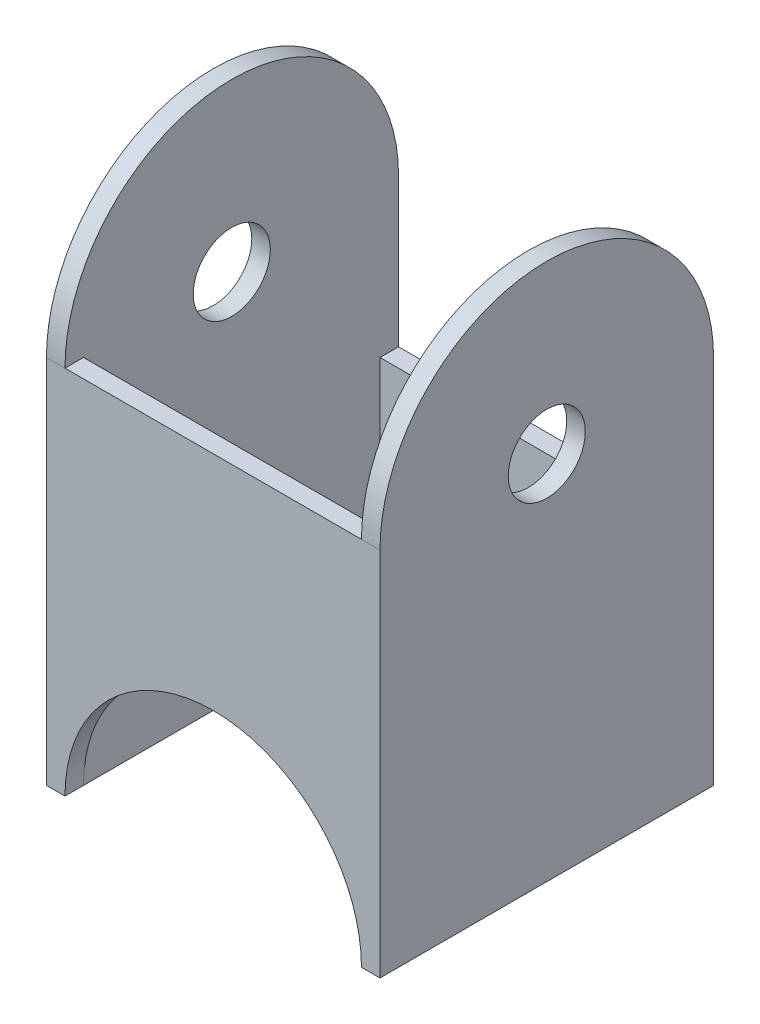
ISO-10303-21;
HEADER;
FILE_DESCRIPTION(('STEP AP214'),'2;1');
FILE_NAME('part.step','',(''),(''),'','','');
FILE_SCHEMA(('AUTOMOTIVE_DESIGN { 1 0 10303 214 1 1 1 1 }'));
ENDSEC;
DATA;
#1=APPLICATION_CONTEXT('core data for automotive mechanical design processes');
#2=APPLICATION_PROTOCOL_DEFINITION('international standard','automotive_design',2000,#1);
#3=PRODUCT_CONTEXT('',#1,'mechanical');
#4=PRODUCT('Part','Part','',(#3));
#5=PRODUCT_RELATED_PRODUCT_CATEGORY('part','',(#4));
#6=PRODUCT_DEFINITION_FORMATION('','',#4);
#7=PRODUCT_DEFINITION_CONTEXT('part definition',#1,'design');
#8=PRODUCT_DEFINITION('design','',#6,#7);
#9=PRODUCT_DEFINITION_SHAPE('','',#8);
#10=(LENGTH_UNIT() NAMED_UNIT(*) SI_UNIT(.MILLI.,.METRE.));
#11=(NAMED_UNIT(*) PLANE_ANGLE_UNIT() SI_UNIT($,.RADIAN.));
#12=(NAMED_UNIT(*) SI_UNIT($,.STERADIAN.) SOLID_ANGLE_UNIT());
#13=UNCERTAINTY_MEASURE_WITH_UNIT(LENGTH_MEASURE(1.E-05),#10,'distance_accuracy_value','');
#14=(GEOMETRIC_REPRESENTATION_CONTEXT(3) GLOBAL_UNCERTAINTY_ASSIGNED_CONTEXT((#13)) GLOBAL_UNIT_ASSIGNED_CONTEXT((#10,
#11,#12)) REPRESENTATION_CONTEXT('',''));
#15=CARTESIAN_POINT('',(0.,0.,0.));
#16=DIRECTION('',(0.,0.,1.));
#17=DIRECTION('',(1.,0.,0.));
#18=AXIS2_PLACEMENT_3D('',#15,#16,#17);
#19=CARTESIAN_POINT('',(0.,0.,0.));
#20=DIRECTION('',(0.,1.,0.));
#21=DIRECTION('',(0.,0.,1.));
#22=AXIS2_PLACEMENT_3D('',#19,#20,#21);
#23=PLANE('',#22);
#24=DIRECTION('',(-1.,0.,0.));
#25=VECTOR('',#24,1.);
#26=CARTESIAN_POINT('',(-14.2875,0.,-14.2875));
#27=LINE('',#26,#25);
#28=CARTESIAN_POINT('',(-12.7,0.,-14.2875));
#29=VERTEX_POINT('',#28);
#30=CARTESIAN_POINT('',(-14.2875,0.,-14.2875));
#31=VERTEX_POINT('',#30);
#32=EDGE_CURVE('E241',#29,#31,#27,.T.);
#33=ORIENTED_EDGE('',*,*,#32,.F.);
#34=DIRECTION('',(0.,0.,1.));
#35=VECTOR('',#34,1.);
#36=CARTESIAN_POINT('',(-12.7,0.,-14.2875));
#37=LINE('',#36,#35);
#38=CARTESIAN_POINT('',(-12.7,0.,-12.7));
#39=VERTEX_POINT('',#38);
#40=EDGE_CURVE('E184',#29,#39,#37,.T.);
#41=ORIENTED_EDGE('',*,*,#40,.T.);
#42=DIRECTION('',(0.,0.,1.));
#43=VECTOR('',#42,1.);
#44=CARTESIAN_POINT('',(-12.7,0.,-12.7));
#45=LINE('',#44,#43);
#46=CARTESIAN_POINT('',(-12.7,0.,12.7));
#47=VERTEX_POINT('',#46);
#48=EDGE_CURVE('E218',#39,#47,#45,.T.);
#49=ORIENTED_EDGE('',*,*,#48,.T.);
#50=CARTESIAN_POINT('',(-12.7,0.,14.2875));
#51=VERTEX_POINT('',#50);
#52=EDGE_CURVE('E181',#47,#51,#37,.T.);
#53=ORIENTED_EDGE('',*,*,#52,.T.);
#54=DIRECTION('',(1.,0.,0.));
#55=VECTOR('',#54,1.);
#56=CARTESIAN_POINT('',(-14.2875,0.,14.2875));
#57=LINE('',#56,#55);
#58=CARTESIAN_POINT('',(-14.2875,0.,14.2875));
#59=VERTEX_POINT('',#58);
#60=EDGE_CURVE('E234',#59,#51,#57,.T.);
#61=ORIENTED_EDGE('',*,*,#60,.F.);
#62=DIRECTION('',(0.,0.,1.));
#63=VECTOR('',#62,1.);
#64=CARTESIAN_POINT('',(-14.2875,0.,-14.2875));
#65=LINE('',#64,#63);
#66=EDGE_CURVE('E245',#31,#59,#65,.T.);
#67=ORIENTED_EDGE('',*,*,#66,.F.);
#68=EDGE_LOOP('',(#33,#41,#49,#53,#61,#67));
#69=FACE_BOUND('',#68,.T.);
#70=ADVANCED_FACE('F41',(#69),#23,.F.);
#71=CARTESIAN_POINT('',(0.,31.75,0.));
#72=DIRECTION('',(0.,1.,0.));
#73=DIRECTION('',(0.,0.,1.));
#74=AXIS2_PLACEMENT_3D('',#71,#72,#73);
#75=PLANE('',#74);
#76=DIRECTION('',(0.,0.,1.));
#77=VECTOR('',#76,1.);
#78=CARTESIAN_POINT('',(12.7,31.75,0.));
#79=LINE('',#78,#77);
#80=CARTESIAN_POINT('',(12.7,31.75,12.7));
#81=VERTEX_POINT('',#80);
#82=CARTESIAN_POINT('',(12.7,31.75,14.2875));
#83=VERTEX_POINT('',#82);
#84=EDGE_CURVE('E201',#81,#83,#79,.T.);
#85=ORIENTED_EDGE('',*,*,#84,.F.);
#86=DIRECTION('',(1.,0.,0.));
#87=VECTOR('',#86,1.);
#88=CARTESIAN_POINT('',(-12.7,31.75,12.7));
#89=LINE('',#88,#87);
#90=CARTESIAN_POINT('',(-12.7,31.75,12.7));
#91=VERTEX_POINT('',#90);
#92=EDGE_CURVE('E215',#91,#81,#89,.T.);
#93=ORIENTED_EDGE('',*,*,#92,.F.);
#94=DIRECTION('',(0.,0.,-1.));
#95=VECTOR('',#94,1.);
#96=CARTESIAN_POINT('',(-12.7,31.75,0.));
#97=LINE('',#96,#95);
#98=CARTESIAN_POINT('',(-12.7,31.75,14.2875));
#99=VERTEX_POINT('',#98);
#100=EDGE_CURVE('E210',#99,#91,#97,.T.);
#101=ORIENTED_EDGE('',*,*,#100,.F.);
#102=DIRECTION('',(1.,0.,0.));
#103=VECTOR('',#102,1.);
#104=CARTESIAN_POINT('',(-14.2875,31.75,14.2875));
#105=LINE('',#104,#103);
#106=EDGE_CURVE('E233',#99,#83,#105,.T.);
#107=ORIENTED_EDGE('',*,*,#106,.T.);
#108=EDGE_LOOP('',(#85,#93,#101,#107));
#109=FACE_BOUND('',#108,.T.);
#110=ADVANCED_FACE('F279',(#109),#75,.T.);
#111=CARTESIAN_POINT('',(12.7,0.,14.2875));
#112=VERTEX_POINT('',#111);
#113=CARTESIAN_POINT('',(14.2875,0.,14.2875));
#114=VERTEX_POINT('',#113);
#115=EDGE_CURVE('E247',#112,#114,#57,.T.);
#116=ORIENTED_EDGE('',*,*,#115,.F.);
#117=DIRECTION('',(0.,0.,1.));
#118=VECTOR('',#117,1.);
#119=CARTESIAN_POINT('',(12.7,0.,-14.2875));
#120=LINE('',#119,#118);
#121=CARTESIAN_POINT('',(12.7,0.,12.7));
#122=VERTEX_POINT('',#121);
#123=EDGE_CURVE('E178',#112,#122,#120,.F.);
#124=ORIENTED_EDGE('',*,*,#123,.T.);
#125=DIRECTION('',(0.,0.,-1.));
#126=VECTOR('',#125,1.);
#127=CARTESIAN_POINT('',(12.7,0.,-12.7));
#128=LINE('',#127,#126);
#129=CARTESIAN_POINT('',(12.7,0.,-12.7));
#130=VERTEX_POINT('',#129);
#131=EDGE_CURVE('E214',#122,#130,#128,.T.);
#132=ORIENTED_EDGE('',*,*,#131,.T.);
#133=CARTESIAN_POINT('',(12.7,0.,-14.2875));
#134=VERTEX_POINT('',#133);
#135=EDGE_CURVE('E174',#130,#134,#120,.F.);
#136=ORIENTED_EDGE('',*,*,#135,.T.);
#137=CARTESIAN_POINT('',(14.2875,0.,-14.2875));
#138=VERTEX_POINT('',#137);
#139=EDGE_CURVE('E242',#138,#134,#27,.T.);
#140=ORIENTED_EDGE('',*,*,#139,.F.);
#141=DIRECTION('',(0.,0.,-1.));
#142=VECTOR('',#141,1.);
#143=CARTESIAN_POINT('',(14.2875,0.,-14.2875));
#144=LINE('',#143,#142);
#145=EDGE_CURVE('E229',#114,#138,#144,.T.);
#146=ORIENTED_EDGE('',*,*,#145,.F.);
#147=EDGE_LOOP('',(#116,#124,#132,#136,#140,#146));
#148=FACE_BOUND('',#147,.T.);
#149=ADVANCED_FACE('F282',(#148),#23,.F.);
#150=CARTESIAN_POINT('',(14.2875,31.75,-14.2875));
#151=DIRECTION('',(-1.,0.,0.));
#152=DIRECTION('',(0.,0.,1.));
#153=AXIS2_PLACEMENT_3D('',#150,#151,#152);
#154=PLANE('',#153);
#155=CARTESIAN_POINT('',(14.2875,31.75,0.));
#156=DIRECTION('',(-1.,0.,0.));
#157=DIRECTION('',(0.,0.,1.));
#158=AXIS2_PLACEMENT_3D('',#155,#156,#157);
#159=CIRCLE('',#158,3.302);
#160=CARTESIAN_POINT('',(14.2875,31.75,3.302));
#161=VERTEX_POINT('',#160);
#162=EDGE_CURVE('E185',#161,#161,#159,.T.);
#163=ORIENTED_EDGE('',*,*,#162,.T.);
#164=EDGE_LOOP('',(#163));
#165=FACE_BOUND('',#164,.T.);
#166=DIRECTION('',(0.,-1.,0.));
#167=VECTOR('',#166,1.);
#168=CARTESIAN_POINT('',(14.2875,31.75,-14.2875));
#169=LINE('',#168,#167);
#170=CARTESIAN_POINT('',(14.2875,31.75,-14.2875));
#171=VERTEX_POINT('',#170);
#172=EDGE_CURVE('E49',#171,#138,#169,.T.);
#173=ORIENTED_EDGE('',*,*,#172,.F.);
#174=CARTESIAN_POINT('',(14.2875,31.75,0.));
#175=DIRECTION('',(1.,0.,0.));
#176=DIRECTION('',(0.,0.,-1.));
#177=AXIS2_PLACEMENT_3D('',#174,#175,#176);
#178=CIRCLE('',#177,14.2875);
#179=CARTESIAN_POINT('',(14.2875,31.75,14.2875));
#180=VERTEX_POINT('',#179);
#181=EDGE_CURVE('E195',#171,#180,#178,.T.);
#182=ORIENTED_EDGE('',*,*,#181,.T.);
#183=DIRECTION('',(0.,-1.,0.));
#184=VECTOR('',#183,1.);
#185=CARTESIAN_POINT('',(14.2875,31.75,14.2875));
#186=LINE('',#185,#184);
#187=EDGE_CURVE('E238',#180,#114,#186,.T.);
#188=ORIENTED_EDGE('',*,*,#187,.T.);
#189=ORIENTED_EDGE('',*,*,#145,.T.);
#190=EDGE_LOOP('',(#173,#182,#188,#189));
#191=FACE_BOUND('',#190,.T.);
#192=ADVANCED_FACE('F43',(#165,#191),#154,.F.);
#193=CARTESIAN_POINT('',(-14.2875,31.75,-14.2875));
#194=DIRECTION('',(0.,0.,1.));
#195=DIRECTION('',(1.,0.,0.));
#196=AXIS2_PLACEMENT_3D('',#193,#194,#195);
#197=PLANE('',#196);
#198=DIRECTION('',(-1.,0.,0.));
#199=VECTOR('',#198,1.);
#200=CARTESIAN_POINT('',(27.7111525448112,31.75,-14.2875));
#201=LINE('',#200,#199);
#202=CARTESIAN_POINT('',(-12.7,31.75,-14.2875));
#203=VERTEX_POINT('',#202);
#204=CARTESIAN_POINT('',(-14.2875,31.75,-14.2875));
#205=VERTEX_POINT('',#204);
#206=EDGE_CURVE('E161',#203,#205,#201,.T.);
#207=ORIENTED_EDGE('',*,*,#206,.F.);
#208=DIRECTION('',(0.,1.,0.));
#209=VECTOR('',#208,1.);
#210=CARTESIAN_POINT('',(-12.7,31.75,-14.2875));
#211=LINE('',#210,#209);
#212=CARTESIAN_POINT('',(-12.7,19.05,-14.2875));
#213=VERTEX_POINT('',#212);
#214=EDGE_CURVE('E142',#213,#203,#211,.T.);
#215=ORIENTED_EDGE('',*,*,#214,.F.);
#216=DIRECTION('',(-1.,0.,0.));
#217=VECTOR('',#216,1.);
#218=CARTESIAN_POINT('',(-12.7,19.05,-14.2875));
#219=LINE('',#218,#217);
#220=CARTESIAN_POINT('',(12.7,19.05,-14.2875));
#221=VERTEX_POINT('',#220);
#222=EDGE_CURVE('E153',#221,#213,#219,.T.);
#223=ORIENTED_EDGE('',*,*,#222,.F.);
#224=DIRECTION('',(0.,-1.,0.));
#225=VECTOR('',#224,1.);
#226=CARTESIAN_POINT('',(12.7,31.75,-14.2875));
#227=LINE('',#226,#225);
#228=CARTESIAN_POINT('',(12.7,31.75,-14.2875));
#229=VERTEX_POINT('',#228);
#230=EDGE_CURVE('E163',#229,#221,#227,.T.);
#231=ORIENTED_EDGE('',*,*,#230,.F.);
#232=DIRECTION('',(-1.,0.,0.));
#233=VECTOR('',#232,1.);
#234=CARTESIAN_POINT('',(-14.2875,31.75,-14.2875));
#235=LINE('',#234,#233);
#236=EDGE_CURVE('E230',#171,#229,#235,.T.);
#237=ORIENTED_EDGE('',*,*,#236,.F.);
#238=ORIENTED_EDGE('',*,*,#172,.T.);
#239=ORIENTED_EDGE('',*,*,#139,.T.);
#240=CARTESIAN_POINT('',(0.,0.,-14.2875));
#241=DIRECTION('',(0.,0.,1.));
#242=DIRECTION('',(1.,0.,0.));
#243=AXIS2_PLACEMENT_3D('',#240,#241,#242);
#244=CIRCLE('',#243,12.7);
#245=EDGE_CURVE('E157',#134,#29,#244,.T.);
#246=ORIENTED_EDGE('',*,*,#245,.T.);
#247=ORIENTED_EDGE('',*,*,#32,.T.);
#248=DIRECTION('',(0.,-1.,0.));
#249=VECTOR('',#248,1.);
#250=CARTESIAN_POINT('',(-14.2875,31.75,-14.2875));
#251=LINE('',#250,#249);
#252=EDGE_CURVE('E255',#205,#31,#251,.T.);
#253=ORIENTED_EDGE('',*,*,#252,.F.);
#254=EDGE_LOOP('',(#207,#215,#223,#231,#237,#238,#239,#246,#247,#253));
#255=FACE_BOUND('',#254,.T.);
#256=ADVANCED_FACE('F159',(#255),#197,.F.);
#257=CARTESIAN_POINT('',(-14.2875,31.75,-14.2875));
#258=DIRECTION('',(1.,0.,0.));
#259=DIRECTION('',(0.,0.,-1.));
#260=AXIS2_PLACEMENT_3D('',#257,#258,#259);
#261=PLANE('',#260);
#262=CARTESIAN_POINT('',(-14.2875,31.75,0.));
#263=DIRECTION('',(1.,0.,0.));
#264=DIRECTION('',(0.,0.,-1.));
#265=AXIS2_PLACEMENT_3D('',#262,#263,#264);
#266=CIRCLE('',#265,3.302);
#267=CARTESIAN_POINT('',(-14.2875,31.75,-3.302));
#268=VERTEX_POINT('',#267);
#269=EDGE_CURVE('E192',#268,#268,#266,.T.);
#270=ORIENTED_EDGE('',*,*,#269,.T.);
#271=EDGE_LOOP('',(#270));
#272=FACE_BOUND('',#271,.T.);
#273=DIRECTION('',(0.,-1.,0.));
#274=VECTOR('',#273,1.);
#275=CARTESIAN_POINT('',(-14.2875,31.75,14.2875));
#276=LINE('',#275,#274);
#277=CARTESIAN_POINT('',(-14.2875,31.75,14.2875));
#278=VERTEX_POINT('',#277);
#279=EDGE_CURVE('E252',#278,#59,#276,.T.);
#280=ORIENTED_EDGE('',*,*,#279,.F.);
#281=CARTESIAN_POINT('',(-14.2875,31.75,0.));
#282=DIRECTION('',(-1.,0.,0.));
#283=DIRECTION('',(0.,0.,1.));
#284=AXIS2_PLACEMENT_3D('',#281,#282,#283);
#285=CIRCLE('',#284,14.2875);
#286=EDGE_CURVE('E205',#278,#205,#285,.T.);
#287=ORIENTED_EDGE('',*,*,#286,.T.);
#288=ORIENTED_EDGE('',*,*,#252,.T.);
#289=ORIENTED_EDGE('',*,*,#66,.T.);
#290=EDGE_LOOP('',(#280,#287,#288,#289));
#291=FACE_BOUND('',#290,.T.);
#292=ADVANCED_FACE('F320',(#272,#291),#261,.F.);
#293=CARTESIAN_POINT('',(-14.2875,31.75,14.2875));
#294=DIRECTION('',(0.,0.,-1.));
#295=DIRECTION('',(-1.,0.,0.));
#296=AXIS2_PLACEMENT_3D('',#293,#294,#295);
#297=PLANE('',#296);
#298=ORIENTED_EDGE('',*,*,#60,.T.);
#299=CARTESIAN_POINT('',(0.,0.,14.2875));
#300=DIRECTION('',(0.,0.,-1.));
#301=DIRECTION('',(-1.,0.,0.));
#302=AXIS2_PLACEMENT_3D('',#299,#300,#301);
#303=CIRCLE('',#302,12.7);
#304=EDGE_CURVE('E177',#51,#112,#303,.T.);
#305=ORIENTED_EDGE('',*,*,#304,.T.);
#306=ORIENTED_EDGE('',*,*,#115,.T.);
#307=ORIENTED_EDGE('',*,*,#187,.F.);
#308=DIRECTION('',(1.,0.,0.));
#309=VECTOR('',#308,1.);
#310=CARTESIAN_POINT('',(-27.7111525448112,31.75,14.2875));
#311=LINE('',#310,#309);
#312=EDGE_CURVE('E56',#83,#180,#311,.T.);
#313=ORIENTED_EDGE('',*,*,#312,.F.);
#314=ORIENTED_EDGE('',*,*,#106,.F.);
#315=EDGE_CURVE('E235',#278,#99,#105,.T.);
#316=ORIENTED_EDGE('',*,*,#315,.F.);
#317=ORIENTED_EDGE('',*,*,#279,.T.);
#318=EDGE_LOOP('',(#298,#305,#306,#307,#313,#314,#316,#317));
#319=FACE_BOUND('',#318,.T.);
#320=ADVANCED_FACE('F301',(#319),#297,.F.);
#321=CARTESIAN_POINT('',(12.7,31.75,-12.7));
#322=DIRECTION('',(-1.,0.,0.));
#323=DIRECTION('',(0.,0.,1.));
#324=AXIS2_PLACEMENT_3D('',#321,#322,#323);
#325=PLANE('',#324);
#326=CARTESIAN_POINT('',(12.7,31.75,0.));
#327=DIRECTION('',(-1.,0.,0.));
#328=DIRECTION('',(0.,0.,1.));
#329=AXIS2_PLACEMENT_3D('',#326,#327,#328);
#330=CIRCLE('',#329,3.302);
#331=CARTESIAN_POINT('',(12.7,31.75,3.302));
#332=VERTEX_POINT('',#331);
#333=EDGE_CURVE('E189',#332,#332,#330,.T.);
#334=ORIENTED_EDGE('',*,*,#333,.F.);
#335=EDGE_LOOP('',(#334));
#336=FACE_BOUND('',#335,.T.);
#337=ORIENTED_EDGE('',*,*,#131,.F.);
#338=DIRECTION('',(0.,-1.,0.));
#339=VECTOR('',#338,1.);
#340=CARTESIAN_POINT('',(12.7,31.75,12.7));
#341=LINE('',#340,#339);
#342=EDGE_CURVE('E217',#81,#122,#341,.T.);
#343=ORIENTED_EDGE('',*,*,#342,.F.);
#344=ORIENTED_EDGE('',*,*,#84,.T.);
#345=CARTESIAN_POINT('',(12.7,31.75,0.));
#346=DIRECTION('',(-1.,0.,0.));
#347=DIRECTION('',(0.,0.,1.));
#348=AXIS2_PLACEMENT_3D('',#345,#346,#347);
#349=CIRCLE('',#348,14.2875);
#350=EDGE_CURVE('E198',#229,#83,#349,.F.);
#351=ORIENTED_EDGE('',*,*,#350,.F.);
#352=ORIENTED_EDGE('',*,*,#230,.T.);
#353=DIRECTION('',(0.,0.,1.));
#354=VECTOR('',#353,1.);
#355=CARTESIAN_POINT('',(12.7,19.05,-14.2885));
#356=LINE('',#355,#354);
#357=CARTESIAN_POINT('',(12.7,19.05,-12.7));
#358=VERTEX_POINT('',#357);
#359=EDGE_CURVE('E149',#221,#358,#356,.T.);
#360=ORIENTED_EDGE('',*,*,#359,.T.);
#361=DIRECTION('',(0.,-1.,0.));
#362=VECTOR('',#361,1.);
#363=CARTESIAN_POINT('',(12.7,31.75,-12.7));
#364=LINE('',#363,#362);
#365=EDGE_CURVE('E227',#358,#130,#364,.T.);
#366=ORIENTED_EDGE('',*,*,#365,.T.);
#367=EDGE_LOOP('',(#337,#343,#344,#351,#352,#360,#366));
#368=FACE_BOUND('',#367,.T.);
#369=ADVANCED_FACE('F275',(#336,#368),#325,.T.);
#370=CARTESIAN_POINT('',(-12.7,31.75,-12.7));
#371=DIRECTION('',(0.,0.,1.));
#372=DIRECTION('',(1.,0.,0.));
#373=AXIS2_PLACEMENT_3D('',#370,#371,#372);
#374=PLANE('',#373);
#375=DIRECTION('',(1.,0.,0.));
#376=VECTOR('',#375,1.);
#377=CARTESIAN_POINT('',(-12.7,19.05,-12.7));
#378=LINE('',#377,#376);
#379=CARTESIAN_POINT('',(-12.7,19.05,-12.7));
#380=VERTEX_POINT('',#379);
#381=EDGE_CURVE('E150',#380,#358,#378,.T.);
#382=ORIENTED_EDGE('',*,*,#381,.F.);
#383=DIRECTION('',(0.,-1.,0.));
#384=VECTOR('',#383,1.);
#385=CARTESIAN_POINT('',(-12.7,31.75,-12.7));
#386=LINE('',#385,#384);
#387=EDGE_CURVE('E145',#380,#39,#386,.T.);
#388=ORIENTED_EDGE('',*,*,#387,.T.);
#389=CARTESIAN_POINT('',(0.,0.,-12.7));
#390=DIRECTION('',(0.,0.,1.));
#391=DIRECTION('',(1.,0.,0.));
#392=AXIS2_PLACEMENT_3D('',#389,#390,#391);
#393=CIRCLE('',#392,12.7);
#394=EDGE_CURVE('E171',#130,#39,#393,.T.);
#395=ORIENTED_EDGE('',*,*,#394,.F.);
#396=ORIENTED_EDGE('',*,*,#365,.F.);
#397=EDGE_LOOP('',(#382,#388,#395,#396));
#398=FACE_BOUND('',#397,.T.);
#399=ADVANCED_FACE('F266',(#398),#374,.T.);
#400=CARTESIAN_POINT('',(-12.7,31.75,-12.7));
#401=DIRECTION('',(1.,0.,0.));
#402=DIRECTION('',(0.,0.,-1.));
#403=AXIS2_PLACEMENT_3D('',#400,#401,#402);
#404=PLANE('',#403);
#405=ORIENTED_EDGE('',*,*,#214,.T.);
#406=CARTESIAN_POINT('',(-12.7,31.75,0.));
#407=DIRECTION('',(1.,0.,0.));
#408=DIRECTION('',(0.,0.,-1.));
#409=AXIS2_PLACEMENT_3D('',#406,#407,#408);
#410=CIRCLE('',#409,14.2875);
#411=EDGE_CURVE('E208',#99,#203,#410,.F.);
#412=ORIENTED_EDGE('',*,*,#411,.F.);
#413=ORIENTED_EDGE('',*,*,#100,.T.);
#414=DIRECTION('',(0.,-1.,0.));
#415=VECTOR('',#414,1.);
#416=CARTESIAN_POINT('',(-12.7,31.75,12.7));
#417=LINE('',#416,#415);
#418=EDGE_CURVE('E64',#91,#47,#417,.T.);
#419=ORIENTED_EDGE('',*,*,#418,.T.);
#420=ORIENTED_EDGE('',*,*,#48,.F.);
#421=ORIENTED_EDGE('',*,*,#387,.F.);
#422=DIRECTION('',(0.,0.,1.));
#423=VECTOR('',#422,1.);
#424=CARTESIAN_POINT('',(-12.7,19.05,-14.2885));
#425=LINE('',#424,#423);
#426=EDGE_CURVE('E136',#213,#380,#425,.T.);
#427=ORIENTED_EDGE('',*,*,#426,.F.);
#428=EDGE_LOOP('',(#405,#412,#413,#419,#420,#421,#427));
#429=FACE_BOUND('',#428,.T.);
#430=CARTESIAN_POINT('',(-12.7,31.75,0.));
#431=DIRECTION('',(1.,0.,0.));
#432=DIRECTION('',(0.,0.,-1.));
#433=AXIS2_PLACEMENT_3D('',#430,#431,#432);
#434=CIRCLE('',#433,3.302);
#435=CARTESIAN_POINT('',(-12.7,31.75,-3.302));
#436=VERTEX_POINT('',#435);
#437=EDGE_CURVE('E188',#436,#436,#434,.T.);
#438=ORIENTED_EDGE('',*,*,#437,.F.);
#439=EDGE_LOOP('',(#438));
#440=FACE_BOUND('',#439,.T.);
#441=ADVANCED_FACE('F138',(#429,#440),#404,.T.);
#442=CARTESIAN_POINT('',(-12.7,31.75,12.7));
#443=DIRECTION('',(0.,0.,-1.));
#444=DIRECTION('',(-1.,0.,0.));
#445=AXIS2_PLACEMENT_3D('',#442,#443,#444);
#446=PLANE('',#445);
#447=CARTESIAN_POINT('',(0.,0.,12.7));
#448=DIRECTION('',(0.,0.,-1.));
#449=DIRECTION('',(-1.,0.,0.));
#450=AXIS2_PLACEMENT_3D('',#447,#448,#449);
#451=CIRCLE('',#450,12.7);
#452=EDGE_CURVE('E11',#47,#122,#451,.T.);
#453=ORIENTED_EDGE('',*,*,#452,.F.);
#454=ORIENTED_EDGE('',*,*,#418,.F.);
#455=ORIENTED_EDGE('',*,*,#92,.T.);
#456=ORIENTED_EDGE('',*,*,#342,.T.);
#457=EDGE_LOOP('',(#453,#454,#455,#456));
#458=FACE_BOUND('',#457,.T.);
#459=ADVANCED_FACE('F265',(#458),#446,.T.);
#460=CARTESIAN_POINT('',(27.7111525448112,31.75,0.));
#461=DIRECTION('',(-1.,0.,0.));
#462=DIRECTION('',(0.,0.,1.));
#463=AXIS2_PLACEMENT_3D('',#460,#461,#462);
#464=CYLINDRICAL_SURFACE('',#463,14.2875);
#465=ORIENTED_EDGE('',*,*,#411,.T.);
#466=ORIENTED_EDGE('',*,*,#206,.T.);
#467=ORIENTED_EDGE('',*,*,#286,.F.);
#468=ORIENTED_EDGE('',*,*,#315,.T.);
#469=EDGE_LOOP('',(#465,#466,#467,#468));
#470=FACE_BOUND('',#469,.T.);
#471=ADVANCED_FACE('F273',(#470),#464,.T.);
#472=CARTESIAN_POINT('',(-27.7111525448112,31.75,0.));
#473=DIRECTION('',(1.,0.,0.));
#474=DIRECTION('',(0.,0.,-1.));
#475=AXIS2_PLACEMENT_3D('',#472,#473,#474);
#476=CYLINDRICAL_SURFACE('',#475,14.2875);
#477=ORIENTED_EDGE('',*,*,#236,.T.);
#478=ORIENTED_EDGE('',*,*,#350,.T.);
#479=ORIENTED_EDGE('',*,*,#312,.T.);
#480=ORIENTED_EDGE('',*,*,#181,.F.);
#481=EDGE_LOOP('',(#477,#478,#479,#480));
#482=FACE_BOUND('',#481,.T.);
#483=ADVANCED_FACE('F306',(#482),#476,.T.);
#484=CARTESIAN_POINT('',(14.2875,31.75,0.));
#485=DIRECTION('',(-1.,0.,0.));
#486=DIRECTION('',(0.,0.,1.));
#487=AXIS2_PLACEMENT_3D('',#484,#485,#486);
#488=CYLINDRICAL_SURFACE('',#487,3.302);
#489=ORIENTED_EDGE('',*,*,#437,.T.);
#490=EDGE_LOOP('',(#489));
#491=FACE_BOUND('',#490,.T.);
#492=ORIENTED_EDGE('',*,*,#269,.F.);
#493=EDGE_LOOP('',(#492));
#494=FACE_BOUND('',#493,.T.);
#495=ADVANCED_FACE('F262',(#491,#494),#488,.F.);
#496=ORIENTED_EDGE('',*,*,#333,.T.);
#497=EDGE_LOOP('',(#496));
#498=FACE_BOUND('',#497,.T.);
#499=ORIENTED_EDGE('',*,*,#162,.F.);
#500=EDGE_LOOP('',(#499));
#501=FACE_BOUND('',#500,.T.);
#502=ADVANCED_FACE('F328',(#498,#501),#488,.F.);
#503=CARTESIAN_POINT('',(0.,0.,-14.2875));
#504=DIRECTION('',(0.,0.,1.));
#505=DIRECTION('',(1.,0.,0.));
#506=AXIS2_PLACEMENT_3D('',#503,#504,#505);
#507=CYLINDRICAL_SURFACE('',#506,12.7);
#508=ORIENTED_EDGE('',*,*,#452,.T.);
#509=ORIENTED_EDGE('',*,*,#123,.F.);
#510=ORIENTED_EDGE('',*,*,#304,.F.);
#511=ORIENTED_EDGE('',*,*,#52,.F.);
#512=EDGE_LOOP('',(#508,#509,#510,#511));
#513=FACE_BOUND('',#512,.T.);
#514=ADVANCED_FACE('F325',(#513),#507,.F.);
#515=ORIENTED_EDGE('',*,*,#245,.F.);
#516=ORIENTED_EDGE('',*,*,#135,.F.);
#517=ORIENTED_EDGE('',*,*,#394,.T.);
#518=ORIENTED_EDGE('',*,*,#40,.F.);
#519=EDGE_LOOP('',(#515,#516,#517,#518));
#520=FACE_BOUND('',#519,.T.);
#521=ADVANCED_FACE('F327',(#520),#507,.F.);
#522=CARTESIAN_POINT('',(-12.7,19.05,-14.2885));
#523=DIRECTION('',(0.,-1.,0.));
#524=DIRECTION('',(0.,0.,-1.));
#525=AXIS2_PLACEMENT_3D('',#522,#523,#524);
#526=PLANE('',#525);
#527=ORIENTED_EDGE('',*,*,#222,.T.);
#528=ORIENTED_EDGE('',*,*,#426,.T.);
#529=ORIENTED_EDGE('',*,*,#381,.T.);
#530=ORIENTED_EDGE('',*,*,#359,.F.);
#531=EDGE_LOOP('',(#527,#528,#529,#530));
#532=FACE_BOUND('',#531,.T.);
#533=ADVANCED_FACE('F154',(#532),#526,.F.);
#534=CLOSED_SHELL('',(#70,#110,#149,#192,#256,#292,#320,#369,#399,#441,#459,#471,#483,#495,#502,
#514,#521,#533));
#535=MANIFOLD_SOLID_BREP('B2',#534);
#536=ADVANCED_BREP_SHAPE_REPRESENTATION('',(#18,#535),#14);
#537=SHAPE_DEFINITION_REPRESENTATION(#9,#536);
ENDSEC;
END-ISO-10303-21;
